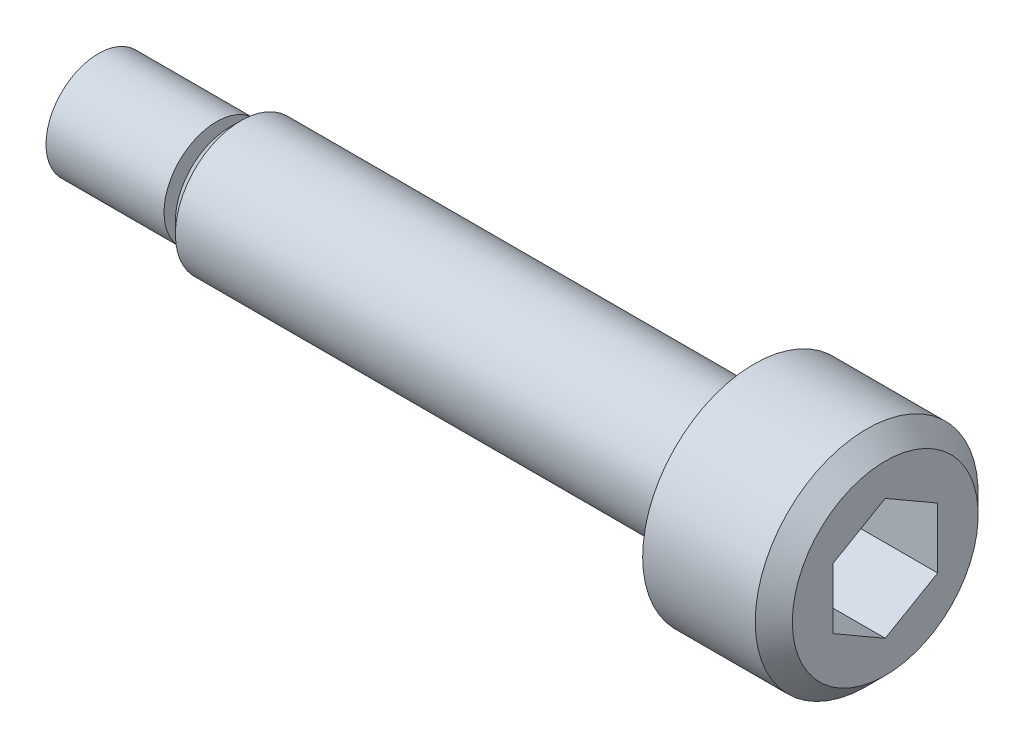
ISO-10303-21;
HEADER;
FILE_DESCRIPTION(('STEP AP214'),'2;1');
FILE_NAME('part.step','',(''),(''),'','','');
FILE_SCHEMA(('AUTOMOTIVE_DESIGN { 1 0 10303 214 1 1 1 1 }'));
ENDSEC;
DATA;
#1=APPLICATION_CONTEXT('core data for automotive mechanical design processes');
#2=APPLICATION_PROTOCOL_DEFINITION('international standard','automotive_design',2000,#1);
#3=PRODUCT_CONTEXT('',#1,'mechanical');
#4=PRODUCT('Part','Part','',(#3));
#5=PRODUCT_RELATED_PRODUCT_CATEGORY('part','',(#4));
#6=PRODUCT_DEFINITION_FORMATION('','',#4);
#7=PRODUCT_DEFINITION_CONTEXT('part definition',#1,'design');
#8=PRODUCT_DEFINITION('design','',#6,#7);
#9=PRODUCT_DEFINITION_SHAPE('','',#8);
#10=(LENGTH_UNIT() NAMED_UNIT(*) SI_UNIT(.MILLI.,.METRE.));
#11=(NAMED_UNIT(*) PLANE_ANGLE_UNIT() SI_UNIT($,.RADIAN.));
#12=(NAMED_UNIT(*) SI_UNIT($,.STERADIAN.) SOLID_ANGLE_UNIT());
#13=UNCERTAINTY_MEASURE_WITH_UNIT(LENGTH_MEASURE(1.E-05),#10,'distance_accuracy_value','');
#14=(GEOMETRIC_REPRESENTATION_CONTEXT(3) GLOBAL_UNCERTAINTY_ASSIGNED_CONTEXT((#13)) GLOBAL_UNIT_ASSIGNED_CONTEXT((#10,
#11,#12)) REPRESENTATION_CONTEXT('',''));
#15=CARTESIAN_POINT('',(0.,0.,0.));
#16=DIRECTION('',(0.,0.,1.));
#17=DIRECTION('',(1.,0.,0.));
#18=AXIS2_PLACEMENT_3D('',#15,#16,#17);
#19=CARTESIAN_POINT('',(25.,3.54289321881345,0.));
#20=DIRECTION('',(-1.,0.,0.));
#21=DIRECTION('',(0.,0.,1.));
#22=AXIS2_PLACEMENT_3D('',#19,#20,#21);
#23=PLANE('',#22);
#24=CARTESIAN_POINT('',(25.,0.,0.));
#25=DIRECTION('',(-1.,0.,0.));
#26=DIRECTION('',(0.,0.,1.));
#27=AXIS2_PLACEMENT_3D('',#24,#25,#26);
#28=CIRCLE('',#27,3.54289321881345);
#29=CARTESIAN_POINT('',(25.,0.,3.54289321881345));
#30=VERTEX_POINT('',#29);
#31=EDGE_CURVE('E177',#30,#30,#28,.T.);
#32=ORIENTED_EDGE('',*,*,#31,.F.);
#33=EDGE_LOOP('',(#32));
#34=FACE_BOUND('',#33,.T.);
#35=DIRECTION('',(0.,-1.,0.));
#36=VECTOR('',#35,1.);
#37=CARTESIAN_POINT('',(25.,1.15470053837925,2.));
#38=LINE('',#37,#36);
#39=CARTESIAN_POINT('',(25.,1.15470053837925,2.));
#40=VERTEX_POINT('',#39);
#41=CARTESIAN_POINT('',(25.,-1.15470053837925,2.));
#42=VERTEX_POINT('',#41);
#43=EDGE_CURVE('E152',#40,#42,#38,.T.);
#44=ORIENTED_EDGE('',*,*,#43,.F.);
#45=DIRECTION('',(0.,-0.5,0.866025403784439));
#46=VECTOR('',#45,1.);
#47=CARTESIAN_POINT('',(25.,2.3094010767585,0.));
#48=LINE('',#47,#46);
#49=CARTESIAN_POINT('',(25.,2.3094010767585,0.));
#50=VERTEX_POINT('',#49);
#51=EDGE_CURVE('E53',#50,#40,#48,.T.);
#52=ORIENTED_EDGE('',*,*,#51,.F.);
#53=DIRECTION('',(0.,0.5,0.866025403784439));
#54=VECTOR('',#53,1.);
#55=CARTESIAN_POINT('',(25.,1.15470053837925,-2.));
#56=LINE('',#55,#54);
#57=CARTESIAN_POINT('',(25.,1.15470053837925,-2.));
#58=VERTEX_POINT('',#57);
#59=EDGE_CURVE('E123',#58,#50,#56,.T.);
#60=ORIENTED_EDGE('',*,*,#59,.F.);
#61=DIRECTION('',(0.,1.,0.));
#62=VECTOR('',#61,1.);
#63=CARTESIAN_POINT('',(25.,-1.15470053837925,-2.));
#64=LINE('',#63,#62);
#65=CARTESIAN_POINT('',(25.,-1.15470053837925,-2.));
#66=VERTEX_POINT('',#65);
#67=EDGE_CURVE('E159',#66,#58,#64,.T.);
#68=ORIENTED_EDGE('',*,*,#67,.F.);
#69=DIRECTION('',(0.,0.5,-0.866025403784439));
#70=VECTOR('',#69,1.);
#71=CARTESIAN_POINT('',(25.,-2.3094010767585,0.));
#72=LINE('',#71,#70);
#73=CARTESIAN_POINT('',(25.,-2.3094010767585,0.));
#74=VERTEX_POINT('',#73);
#75=EDGE_CURVE('E156',#74,#66,#72,.T.);
#76=ORIENTED_EDGE('',*,*,#75,.F.);
#77=DIRECTION('',(0.,-0.5,-0.866025403784439));
#78=VECTOR('',#77,1.);
#79=CARTESIAN_POINT('',(25.,-1.15470053837925,2.));
#80=LINE('',#79,#78);
#81=EDGE_CURVE('E154',#42,#74,#80,.T.);
#82=ORIENTED_EDGE('',*,*,#81,.F.);
#83=EDGE_LOOP('',(#44,#52,#60,#68,#76,#82));
#84=FACE_BOUND('',#83,.T.);
#85=ADVANCED_FACE('F38',(#34,#84),#23,.F.);
#86=CARTESIAN_POINT('',(-5.,0.,0.));
#87=DIRECTION('',(1.,0.,0.));
#88=DIRECTION('',(0.,0.,-1.));
#89=AXIS2_PLACEMENT_3D('',#86,#87,#88);
#90=PLANE('',#89);
#91=CARTESIAN_POINT('',(-5.,0.,0.));
#92=DIRECTION('',(-1.,0.,0.));
#93=DIRECTION('',(0.,0.,1.));
#94=AXIS2_PLACEMENT_3D('',#91,#92,#93);
#95=CIRCLE('',#94,2.);
#96=CARTESIAN_POINT('',(-5.,0.,2.));
#97=VERTEX_POINT('',#96);
#98=EDGE_CURVE('E11',#97,#97,#95,.T.);
#99=ORIENTED_EDGE('',*,*,#98,.T.);
#100=EDGE_LOOP('',(#99));
#101=FACE_BOUND('',#100,.T.);
#102=ADVANCED_FACE('F40',(#101),#90,.F.);
#103=CARTESIAN_POINT('',(25.,0.,0.));
#104=DIRECTION('',(-1.,0.,0.));
#105=DIRECTION('',(0.,0.,1.));
#106=AXIS2_PLACEMENT_3D('',#103,#104,#105);
#107=CYLINDRICAL_SURFACE('',#106,2.);
#108=ORIENTED_EDGE('',*,*,#98,.F.);
#109=EDGE_LOOP('',(#108));
#110=FACE_BOUND('',#109,.T.);
#111=CARTESIAN_POINT('',(-0.5,0.,0.));
#112=DIRECTION('',(-1.,0.,0.));
#113=DIRECTION('',(0.,0.,1.));
#114=AXIS2_PLACEMENT_3D('',#111,#112,#113);
#115=CIRCLE('',#114,2.);
#116=CARTESIAN_POINT('',(-0.5,0.,2.));
#117=VERTEX_POINT('',#116);
#118=EDGE_CURVE('E46',#117,#117,#115,.T.);
#119=ORIENTED_EDGE('',*,*,#118,.T.);
#120=EDGE_LOOP('',(#119));
#121=FACE_BOUND('',#120,.T.);
#122=ADVANCED_FACE('F204',(#110,#121),#107,.T.);
#123=CARTESIAN_POINT('',(-0.5,2.,0.));
#124=DIRECTION('',(-1.,0.,0.));
#125=DIRECTION('',(0.,0.,1.));
#126=AXIS2_PLACEMENT_3D('',#123,#124,#125);
#127=PLANE('',#126);
#128=ORIENTED_EDGE('',*,*,#118,.F.);
#129=EDGE_LOOP('',(#128));
#130=FACE_BOUND('',#129,.T.);
#131=CARTESIAN_POINT('',(-0.5,0.,0.));
#132=DIRECTION('',(-1.,0.,0.));
#133=DIRECTION('',(0.,0.,1.));
#134=AXIS2_PLACEMENT_3D('',#131,#132,#133);
#135=CIRCLE('',#134,1.3);
#136=CARTESIAN_POINT('',(-0.5,0.,1.3));
#137=VERTEX_POINT('',#136);
#138=EDGE_CURVE('E199',#137,#137,#135,.T.);
#139=ORIENTED_EDGE('',*,*,#138,.T.);
#140=EDGE_LOOP('',(#139));
#141=FACE_BOUND('',#140,.T.);
#142=ADVANCED_FACE('F206',(#130,#141),#127,.F.);
#143=CARTESIAN_POINT('',(25.,0.,0.));
#144=DIRECTION('',(-1.,0.,0.));
#145=DIRECTION('',(0.,0.,1.));
#146=AXIS2_PLACEMENT_3D('',#143,#144,#145);
#147=CYLINDRICAL_SURFACE('',#146,1.3);
#148=ORIENTED_EDGE('',*,*,#138,.F.);
#149=EDGE_LOOP('',(#148));
#150=FACE_BOUND('',#149,.T.);
#151=CARTESIAN_POINT('',(0.,0.,0.));
#152=DIRECTION('',(-1.,0.,0.));
#153=DIRECTION('',(0.,0.,1.));
#154=AXIS2_PLACEMENT_3D('',#151,#152,#153);
#155=CIRCLE('',#154,1.3);
#156=CARTESIAN_POINT('',(0.,0.,1.3));
#157=VERTEX_POINT('',#156);
#158=EDGE_CURVE('E196',#157,#157,#155,.T.);
#159=ORIENTED_EDGE('',*,*,#158,.T.);
#160=EDGE_LOOP('',(#159));
#161=FACE_BOUND('',#160,.T.);
#162=ADVANCED_FACE('F209',(#150,#161),#147,.T.);
#163=CARTESIAN_POINT('',(0.,1.3,0.));
#164=DIRECTION('',(1.,0.,0.));
#165=DIRECTION('',(0.,0.,-1.));
#166=AXIS2_PLACEMENT_3D('',#163,#164,#165);
#167=PLANE('',#166);
#168=ORIENTED_EDGE('',*,*,#158,.F.);
#169=EDGE_LOOP('',(#168));
#170=FACE_BOUND('',#169,.T.);
#171=CARTESIAN_POINT('',(0.,0.,0.));
#172=DIRECTION('',(-1.,0.,0.));
#173=DIRECTION('',(0.,0.,1.));
#174=AXIS2_PLACEMENT_3D('',#171,#172,#173);
#175=CIRCLE('',#174,2.067);
#176=CARTESIAN_POINT('',(0.,0.,2.067));
#177=VERTEX_POINT('',#176);
#178=EDGE_CURVE('E193',#177,#177,#175,.T.);
#179=ORIENTED_EDGE('',*,*,#178,.T.);
#180=EDGE_LOOP('',(#179));
#181=FACE_BOUND('',#180,.T.);
#182=ADVANCED_FACE('F215',(#170,#181),#167,.F.);
#183=CARTESIAN_POINT('',(0.432999999999999,0.,0.));
#184=DIRECTION('',(1.,0.,0.));
#185=DIRECTION('',(0.,0.,-1.));
#186=AXIS2_PLACEMENT_3D('',#183,#184,#185);
#187=CONICAL_SURFACE('',#186,2.5,0.785398163397449);
#188=ORIENTED_EDGE('',*,*,#178,.F.);
#189=EDGE_LOOP('',(#188));
#190=FACE_BOUND('',#189,.T.);
#191=CARTESIAN_POINT('',(0.432999999999999,0.,0.));
#192=DIRECTION('',(-1.,0.,0.));
#193=DIRECTION('',(0.,0.,1.));
#194=AXIS2_PLACEMENT_3D('',#191,#192,#193);
#195=CIRCLE('',#194,2.5);
#196=CARTESIAN_POINT('',(0.432999999999999,0.,2.5));
#197=VERTEX_POINT('',#196);
#198=EDGE_CURVE('E190',#197,#197,#195,.T.);
#199=ORIENTED_EDGE('',*,*,#198,.T.);
#200=EDGE_LOOP('',(#199));
#201=FACE_BOUND('',#200,.T.);
#202=ADVANCED_FACE('F221',(#190,#201),#187,.T.);
#203=CARTESIAN_POINT('',(25.,0.,0.));
#204=DIRECTION('',(-1.,0.,0.));
#205=DIRECTION('',(0.,0.,1.));
#206=AXIS2_PLACEMENT_3D('',#203,#204,#205);
#207=CYLINDRICAL_SURFACE('',#206,2.5);
#208=ORIENTED_EDGE('',*,*,#198,.F.);
#209=EDGE_LOOP('',(#208));
#210=FACE_BOUND('',#209,.T.);
#211=CARTESIAN_POINT('',(20.,0.,0.));
#212=DIRECTION('',(-1.,0.,0.));
#213=DIRECTION('',(0.,0.,1.));
#214=AXIS2_PLACEMENT_3D('',#211,#212,#213);
#215=CIRCLE('',#214,2.5);
#216=CARTESIAN_POINT('',(20.,0.,2.5));
#217=VERTEX_POINT('',#216);
#218=EDGE_CURVE('E187',#217,#217,#215,.T.);
#219=ORIENTED_EDGE('',*,*,#218,.T.);
#220=EDGE_LOOP('',(#219));
#221=FACE_BOUND('',#220,.T.);
#222=ADVANCED_FACE('F227',(#210,#221),#207,.T.);
#223=CARTESIAN_POINT('',(20.,2.5,0.));
#224=DIRECTION('',(1.,0.,0.));
#225=DIRECTION('',(0.,0.,-1.));
#226=AXIS2_PLACEMENT_3D('',#223,#224,#225);
#227=PLANE('',#226);
#228=ORIENTED_EDGE('',*,*,#218,.F.);
#229=EDGE_LOOP('',(#228));
#230=FACE_BOUND('',#229,.T.);
#231=CARTESIAN_POINT('',(20.,0.,0.));
#232=DIRECTION('',(-1.,0.,0.));
#233=DIRECTION('',(0.,0.,1.));
#234=AXIS2_PLACEMENT_3D('',#231,#232,#233);
#235=CIRCLE('',#234,4.25);
#236=CARTESIAN_POINT('',(20.,0.,4.25));
#237=VERTEX_POINT('',#236);
#238=EDGE_CURVE('E184',#237,#237,#235,.T.);
#239=ORIENTED_EDGE('',*,*,#238,.T.);
#240=EDGE_LOOP('',(#239));
#241=FACE_BOUND('',#240,.T.);
#242=ADVANCED_FACE('F233',(#230,#241),#227,.F.);
#243=CARTESIAN_POINT('',(25.,0.,0.));
#244=DIRECTION('',(-1.,0.,0.));
#245=DIRECTION('',(0.,0.,1.));
#246=AXIS2_PLACEMENT_3D('',#243,#244,#245);
#247=CYLINDRICAL_SURFACE('',#246,4.25);
#248=ORIENTED_EDGE('',*,*,#238,.F.);
#249=EDGE_LOOP('',(#248));
#250=FACE_BOUND('',#249,.T.);
#251=CARTESIAN_POINT('',(24.2928932188135,0.,0.));
#252=DIRECTION('',(-1.,0.,0.));
#253=DIRECTION('',(0.,0.,1.));
#254=AXIS2_PLACEMENT_3D('',#251,#252,#253);
#255=CIRCLE('',#254,4.25);
#256=CARTESIAN_POINT('',(24.2928932188135,0.,4.25));
#257=VERTEX_POINT('',#256);
#258=EDGE_CURVE('E181',#257,#257,#255,.T.);
#259=ORIENTED_EDGE('',*,*,#258,.T.);
#260=EDGE_LOOP('',(#259));
#261=FACE_BOUND('',#260,.T.);
#262=ADVANCED_FACE('F239',(#250,#261),#247,.T.);
#263=CARTESIAN_POINT('',(25.,0.,0.));
#264=DIRECTION('',(-1.,0.,0.));
#265=DIRECTION('',(0.,0.,1.));
#266=AXIS2_PLACEMENT_3D('',#263,#264,#265);
#267=CONICAL_SURFACE('',#266,3.54289321881345,0.785398163397448);
#268=ORIENTED_EDGE('',*,*,#258,.F.);
#269=EDGE_LOOP('',(#268));
#270=FACE_BOUND('',#269,.T.);
#271=ORIENTED_EDGE('',*,*,#31,.T.);
#272=EDGE_LOOP('',(#271));
#273=FACE_BOUND('',#272,.T.);
#274=ADVANCED_FACE('F245',(#270,#273),#267,.T.);
#275=CARTESIAN_POINT('',(21.,2.3094010767585,0.));
#276=DIRECTION('',(0.,0.866025403784439,0.5));
#277=DIRECTION('',(0.,-0.5,0.866025403784439));
#278=AXIS2_PLACEMENT_3D('',#275,#276,#277);
#279=PLANE('',#278);
#280=ORIENTED_EDGE('',*,*,#51,.T.);
#281=DIRECTION('',(1.,0.,0.));
#282=VECTOR('',#281,1.);
#283=CARTESIAN_POINT('',(21.,1.15470053837925,2.));
#284=LINE('',#283,#282);
#285=CARTESIAN_POINT('',(21.,1.15470053837925,2.));
#286=VERTEX_POINT('',#285);
#287=EDGE_CURVE('E125',#286,#40,#284,.T.);
#288=ORIENTED_EDGE('',*,*,#287,.F.);
#289=DIRECTION('',(0.,-0.5,0.866025403784439));
#290=VECTOR('',#289,1.);
#291=CARTESIAN_POINT('',(21.,2.3094010767585,0.));
#292=LINE('',#291,#290);
#293=CARTESIAN_POINT('',(21.,1.73205080756888,1.));
#294=VERTEX_POINT('',#293);
#295=EDGE_CURVE('E114',#294,#286,#292,.T.);
#296=ORIENTED_EDGE('',*,*,#295,.F.);
#297=CARTESIAN_POINT('',(21.,2.3094010767585,0.));
#298=VERTEX_POINT('',#297);
#299=EDGE_CURVE('E122',#298,#294,#292,.T.);
#300=ORIENTED_EDGE('',*,*,#299,.F.);
#301=DIRECTION('',(1.,0.,0.));
#302=VECTOR('',#301,1.);
#303=CARTESIAN_POINT('',(21.,2.3094010767585,0.));
#304=LINE('',#303,#302);
#305=EDGE_CURVE('E162',#298,#50,#304,.T.);
#306=ORIENTED_EDGE('',*,*,#305,.T.);
#307=EDGE_LOOP('',(#280,#288,#296,#300,#306));
#308=FACE_BOUND('',#307,.T.);
#309=ADVANCED_FACE('F126',(#308),#279,.F.);
#310=CARTESIAN_POINT('',(21.,1.15470053837925,-2.));
#311=DIRECTION('',(0.,0.866025403784439,-0.5));
#312=DIRECTION('',(0.,0.5,0.866025403784439));
#313=AXIS2_PLACEMENT_3D('',#310,#311,#312);
#314=PLANE('',#313);
#315=ORIENTED_EDGE('',*,*,#59,.T.);
#316=ORIENTED_EDGE('',*,*,#305,.F.);
#317=DIRECTION('',(0.,0.5,0.866025403784439));
#318=VECTOR('',#317,1.);
#319=CARTESIAN_POINT('',(21.,1.15470053837925,-2.));
#320=LINE('',#319,#318);
#321=CARTESIAN_POINT('',(21.,1.73205080756888,-1.));
#322=VERTEX_POINT('',#321);
#323=EDGE_CURVE('E148',#322,#298,#320,.T.);
#324=ORIENTED_EDGE('',*,*,#323,.F.);
#325=CARTESIAN_POINT('',(21.,1.15470053837925,-2.));
#326=VERTEX_POINT('',#325);
#327=EDGE_CURVE('E130',#326,#322,#320,.T.);
#328=ORIENTED_EDGE('',*,*,#327,.F.);
#329=DIRECTION('',(1.,0.,0.));
#330=VECTOR('',#329,1.);
#331=CARTESIAN_POINT('',(21.,1.15470053837925,-2.));
#332=LINE('',#331,#330);
#333=EDGE_CURVE('E165',#326,#58,#332,.T.);
#334=ORIENTED_EDGE('',*,*,#333,.T.);
#335=EDGE_LOOP('',(#315,#316,#324,#328,#334));
#336=FACE_BOUND('',#335,.T.);
#337=ADVANCED_FACE('F287',(#336),#314,.F.);
#338=CARTESIAN_POINT('',(21.,-1.15470053837925,-2.));
#339=DIRECTION('',(0.,0.,-1.));
#340=DIRECTION('',(-1.,0.,0.));
#341=AXIS2_PLACEMENT_3D('',#338,#339,#340);
#342=PLANE('',#341);
#343=ORIENTED_EDGE('',*,*,#67,.T.);
#344=ORIENTED_EDGE('',*,*,#333,.F.);
#345=DIRECTION('',(0.,1.,0.));
#346=VECTOR('',#345,1.);
#347=CARTESIAN_POINT('',(21.,-1.15470053837925,-2.));
#348=LINE('',#347,#346);
#349=CARTESIAN_POINT('',(21.,0.,-2.));
#350=VERTEX_POINT('',#349);
#351=EDGE_CURVE('E146',#350,#326,#348,.T.);
#352=ORIENTED_EDGE('',*,*,#351,.F.);
#353=CARTESIAN_POINT('',(21.,-1.15470053837925,-2.));
#354=VERTEX_POINT('',#353);
#355=EDGE_CURVE('E61',#354,#350,#348,.T.);
#356=ORIENTED_EDGE('',*,*,#355,.F.);
#357=DIRECTION('',(1.,0.,0.));
#358=VECTOR('',#357,1.);
#359=CARTESIAN_POINT('',(21.,-1.15470053837925,-2.));
#360=LINE('',#359,#358);
#361=EDGE_CURVE('E168',#354,#66,#360,.T.);
#362=ORIENTED_EDGE('',*,*,#361,.T.);
#363=EDGE_LOOP('',(#343,#344,#352,#356,#362));
#364=FACE_BOUND('',#363,.T.);
#365=ADVANCED_FACE('F291',(#364),#342,.F.);
#366=CARTESIAN_POINT('',(21.,-2.3094010767585,0.));
#367=DIRECTION('',(0.,-0.866025403784439,-0.5));
#368=DIRECTION('',(0.,0.5,-0.866025403784439));
#369=AXIS2_PLACEMENT_3D('',#366,#367,#368);
#370=PLANE('',#369);
#371=ORIENTED_EDGE('',*,*,#75,.T.);
#372=ORIENTED_EDGE('',*,*,#361,.F.);
#373=DIRECTION('',(0.,0.5,-0.866025403784439));
#374=VECTOR('',#373,1.);
#375=CARTESIAN_POINT('',(21.,-2.3094010767585,0.));
#376=LINE('',#375,#374);
#377=CARTESIAN_POINT('',(21.,-1.73205080756888,-1.));
#378=VERTEX_POINT('',#377);
#379=EDGE_CURVE('E142',#378,#354,#376,.T.);
#380=ORIENTED_EDGE('',*,*,#379,.F.);
#381=CARTESIAN_POINT('',(21.,-2.3094010767585,0.));
#382=VERTEX_POINT('',#381);
#383=EDGE_CURVE('E143',#382,#378,#376,.T.);
#384=ORIENTED_EDGE('',*,*,#383,.F.);
#385=DIRECTION('',(1.,0.,0.));
#386=VECTOR('',#385,1.);
#387=CARTESIAN_POINT('',(21.,-2.3094010767585,0.));
#388=LINE('',#387,#386);
#389=EDGE_CURVE('E171',#382,#74,#388,.T.);
#390=ORIENTED_EDGE('',*,*,#389,.T.);
#391=EDGE_LOOP('',(#371,#372,#380,#384,#390));
#392=FACE_BOUND('',#391,.T.);
#393=ADVANCED_FACE('F294',(#392),#370,.F.);
#394=CARTESIAN_POINT('',(21.,-1.15470053837925,2.));
#395=DIRECTION('',(0.,-0.866025403784439,0.5));
#396=DIRECTION('',(0.,-0.5,-0.866025403784439));
#397=AXIS2_PLACEMENT_3D('',#394,#395,#396);
#398=PLANE('',#397);
#399=ORIENTED_EDGE('',*,*,#81,.T.);
#400=ORIENTED_EDGE('',*,*,#389,.F.);
#401=DIRECTION('',(0.,-0.5,-0.866025403784439));
#402=VECTOR('',#401,1.);
#403=CARTESIAN_POINT('',(21.,-1.15470053837925,2.));
#404=LINE('',#403,#402);
#405=CARTESIAN_POINT('',(21.,-1.73205080756888,1.));
#406=VERTEX_POINT('',#405);
#407=EDGE_CURVE('E136',#406,#382,#404,.T.);
#408=ORIENTED_EDGE('',*,*,#407,.F.);
#409=CARTESIAN_POINT('',(21.,-1.15470053837925,2.));
#410=VERTEX_POINT('',#409);
#411=EDGE_CURVE('E138',#410,#406,#404,.T.);
#412=ORIENTED_EDGE('',*,*,#411,.F.);
#413=DIRECTION('',(1.,0.,0.));
#414=VECTOR('',#413,1.);
#415=CARTESIAN_POINT('',(21.,-1.15470053837925,2.));
#416=LINE('',#415,#414);
#417=EDGE_CURVE('E129',#410,#42,#416,.T.);
#418=ORIENTED_EDGE('',*,*,#417,.T.);
#419=EDGE_LOOP('',(#399,#400,#408,#412,#418));
#420=FACE_BOUND('',#419,.T.);
#421=ADVANCED_FACE('F262',(#420),#398,.F.);
#422=CARTESIAN_POINT('',(21.,1.15470053837925,2.));
#423=DIRECTION('',(0.,0.,1.));
#424=DIRECTION('',(1.,0.,0.));
#425=AXIS2_PLACEMENT_3D('',#422,#423,#424);
#426=PLANE('',#425);
#427=ORIENTED_EDGE('',*,*,#43,.T.);
#428=ORIENTED_EDGE('',*,*,#417,.F.);
#429=DIRECTION('',(0.,-1.,0.));
#430=VECTOR('',#429,1.);
#431=CARTESIAN_POINT('',(21.,1.15470053837925,2.));
#432=LINE('',#431,#430);
#433=CARTESIAN_POINT('',(21.,0.,2.));
#434=VERTEX_POINT('',#433);
#435=EDGE_CURVE('E135',#434,#410,#432,.T.);
#436=ORIENTED_EDGE('',*,*,#435,.F.);
#437=EDGE_CURVE('E117',#286,#434,#432,.T.);
#438=ORIENTED_EDGE('',*,*,#437,.F.);
#439=ORIENTED_EDGE('',*,*,#287,.T.);
#440=EDGE_LOOP('',(#427,#428,#436,#438,#439));
#441=FACE_BOUND('',#440,.T.);
#442=ADVANCED_FACE('F133',(#441),#426,.F.);
#443=CARTESIAN_POINT('',(21.,1.15470053837925,2.));
#444=DIRECTION('',(1.,0.,0.));
#445=DIRECTION('',(0.,0.,-1.));
#446=AXIS2_PLACEMENT_3D('',#443,#444,#445);
#447=PLANE('',#446);
#448=ORIENTED_EDGE('',*,*,#351,.T.);
#449=ORIENTED_EDGE('',*,*,#327,.T.);
#450=CARTESIAN_POINT('',(21.,0.,0.));
#451=DIRECTION('',(-1.,0.,0.));
#452=DIRECTION('',(0.,0.,1.));
#453=AXIS2_PLACEMENT_3D('',#450,#451,#452);
#454=CIRCLE('',#453,2.);
#455=EDGE_CURVE('E276',#322,#350,#454,.T.);
#456=ORIENTED_EDGE('',*,*,#455,.T.);
#457=EDGE_LOOP('',(#448,#449,#456));
#458=FACE_BOUND('',#457,.T.);
#459=ADVANCED_FACE('F288',(#458),#447,.T.);
#460=ORIENTED_EDGE('',*,*,#323,.T.);
#461=ORIENTED_EDGE('',*,*,#299,.T.);
#462=EDGE_CURVE('E178',#294,#322,#454,.T.);
#463=ORIENTED_EDGE('',*,*,#462,.T.);
#464=EDGE_LOOP('',(#460,#461,#463));
#465=FACE_BOUND('',#464,.T.);
#466=ADVANCED_FACE('F283',(#465),#447,.T.);
#467=ORIENTED_EDGE('',*,*,#295,.T.);
#468=ORIENTED_EDGE('',*,*,#437,.T.);
#469=EDGE_CURVE('E119',#434,#294,#454,.T.);
#470=ORIENTED_EDGE('',*,*,#469,.T.);
#471=EDGE_LOOP('',(#467,#468,#470));
#472=FACE_BOUND('',#471,.T.);
#473=ADVANCED_FACE('F115',(#472),#447,.T.);
#474=ORIENTED_EDGE('',*,*,#435,.T.);
#475=ORIENTED_EDGE('',*,*,#411,.T.);
#476=EDGE_CURVE('E164',#406,#434,#454,.T.);
#477=ORIENTED_EDGE('',*,*,#476,.T.);
#478=EDGE_LOOP('',(#474,#475,#477));
#479=FACE_BOUND('',#478,.T.);
#480=ADVANCED_FACE('F267',(#479),#447,.T.);
#481=ORIENTED_EDGE('',*,*,#407,.T.);
#482=ORIENTED_EDGE('',*,*,#383,.T.);
#483=EDGE_CURVE('E272',#378,#406,#454,.T.);
#484=ORIENTED_EDGE('',*,*,#483,.T.);
#485=EDGE_LOOP('',(#481,#482,#484));
#486=FACE_BOUND('',#485,.T.);
#487=ADVANCED_FACE('F296',(#486),#447,.T.);
#488=ORIENTED_EDGE('',*,*,#379,.T.);
#489=ORIENTED_EDGE('',*,*,#355,.T.);
#490=EDGE_CURVE('E274',#350,#378,#454,.T.);
#491=ORIENTED_EDGE('',*,*,#490,.T.);
#492=EDGE_LOOP('',(#488,#489,#491));
#493=FACE_BOUND('',#492,.T.);
#494=ADVANCED_FACE('F298',(#493),#447,.T.);
#495=CARTESIAN_POINT('',(21.,0.,0.));
#496=DIRECTION('',(1.,0.,0.));
#497=DIRECTION('',(0.,0.,-1.));
#498=AXIS2_PLACEMENT_3D('',#495,#496,#497);
#499=CONICAL_SURFACE('',#498,2.,1.0471975511966);
#500=CARTESIAN_POINT('',(19.8452994616207,0.,0.));
#501=VERTEX_POINT('',#500);
#502=VERTEX_LOOP('',#501);
#503=FACE_BOUND('',#502,.T.);
#504=ORIENTED_EDGE('',*,*,#469,.F.);
#505=ORIENTED_EDGE('',*,*,#476,.F.);
#506=ORIENTED_EDGE('',*,*,#483,.F.);
#507=ORIENTED_EDGE('',*,*,#490,.F.);
#508=ORIENTED_EDGE('',*,*,#455,.F.);
#509=ORIENTED_EDGE('',*,*,#462,.F.);
#510=EDGE_LOOP('',(#504,#505,#506,#507,#508,#509));
#511=FACE_BOUND('',#510,.T.);
#512=ADVANCED_FACE('F270',(#503,#511),#499,.F.);
#513=CLOSED_SHELL('',(#85,#102,#122,#142,#162,#182,#202,#222,#242,#262,#274,#309,#337,#365,#393,
#421,#442,#459,#466,#473,#480,#487,#494,#512));
#514=MANIFOLD_SOLID_BREP('B2',#513);
#515=ADVANCED_BREP_SHAPE_REPRESENTATION('',(#18,#514),#14);
#516=SHAPE_DEFINITION_REPRESENTATION(#9,#515);
ENDSEC;
END-ISO-10303-21;
